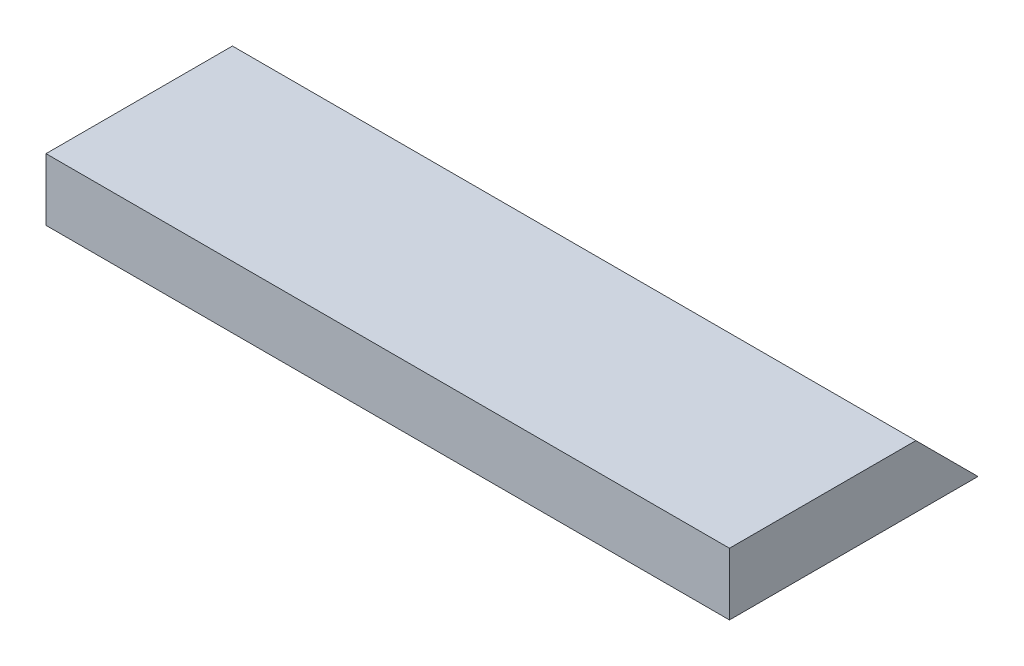
ISO-10303-21;
HEADER;
FILE_DESCRIPTION(('STEP AP214'),'2;1');
FILE_NAME('part.step','',(''),(''),'','','');
FILE_SCHEMA(('AUTOMOTIVE_DESIGN { 1 0 10303 214 1 1 1 1 }'));
ENDSEC;
DATA;
#1=APPLICATION_CONTEXT('core data for automotive mechanical design processes');
#2=APPLICATION_PROTOCOL_DEFINITION('international standard','automotive_design',2000,#1);
#3=PRODUCT_CONTEXT('',#1,'mechanical');
#4=PRODUCT('Part','Part','',(#3));
#5=PRODUCT_RELATED_PRODUCT_CATEGORY('part','',(#4));
#6=PRODUCT_DEFINITION_FORMATION('','',#4);
#7=PRODUCT_DEFINITION_CONTEXT('part definition',#1,'design');
#8=PRODUCT_DEFINITION('design','',#6,#7);
#9=PRODUCT_DEFINITION_SHAPE('','',#8);
#10=(LENGTH_UNIT() NAMED_UNIT(*) SI_UNIT(.MILLI.,.METRE.));
#11=(NAMED_UNIT(*) PLANE_ANGLE_UNIT() SI_UNIT($,.RADIAN.));
#12=(NAMED_UNIT(*) SI_UNIT($,.STERADIAN.) SOLID_ANGLE_UNIT());
#13=UNCERTAINTY_MEASURE_WITH_UNIT(LENGTH_MEASURE(1.E-05),#10,'distance_accuracy_value','');
#14=(GEOMETRIC_REPRESENTATION_CONTEXT(3) GLOBAL_UNCERTAINTY_ASSIGNED_CONTEXT((#13)) GLOBAL_UNIT_ASSIGNED_CONTEXT((#10,
#11,#12)) REPRESENTATION_CONTEXT('',''));
#15=CARTESIAN_POINT('',(0.,0.,0.));
#16=DIRECTION('',(0.,0.,1.));
#17=DIRECTION('',(1.,0.,0.));
#18=AXIS2_PLACEMENT_3D('',#15,#16,#17);
#19=CARTESIAN_POINT('',(0.,5.,0.));
#20=DIRECTION('',(-1.,0.,0.));
#21=DIRECTION('',(0.,0.,1.));
#22=AXIS2_PLACEMENT_3D('',#19,#20,#21);
#23=PLANE('',#22);
#24=DIRECTION('',(0.,0.,-1.));
#25=VECTOR('',#24,1.);
#26=CARTESIAN_POINT('',(0.,0.,0.));
#27=LINE('',#26,#25);
#28=CARTESIAN_POINT('',(0.,0.,0.));
#29=VERTEX_POINT('',#28);
#30=CARTESIAN_POINT('',(0.,0.,-20.));
#31=VERTEX_POINT('',#30);
#32=EDGE_CURVE('E77',#29,#31,#27,.T.);
#33=ORIENTED_EDGE('',*,*,#32,.T.);
#34=DIRECTION('',(0.,-0.707106781186549,-0.707106781186546));
#35=VECTOR('',#34,1.);
#36=CARTESIAN_POINT('',(0.,0.,-20.));
#37=LINE('',#36,#35);
#38=CARTESIAN_POINT('',(0.,5.,-15.));
#39=VERTEX_POINT('',#38);
#40=EDGE_CURVE('E82',#39,#31,#37,.T.);
#41=ORIENTED_EDGE('',*,*,#40,.F.);
#42=DIRECTION('',(0.,0.,-1.));
#43=VECTOR('',#42,1.);
#44=CARTESIAN_POINT('',(0.,5.,0.));
#45=LINE('',#44,#43);
#46=CARTESIAN_POINT('',(0.,5.,0.));
#47=VERTEX_POINT('',#46);
#48=EDGE_CURVE('E72',#47,#39,#45,.T.);
#49=ORIENTED_EDGE('',*,*,#48,.F.);
#50=DIRECTION('',(0.,-1.,0.));
#51=VECTOR('',#50,1.);
#52=CARTESIAN_POINT('',(0.,5.,0.));
#53=LINE('',#52,#51);
#54=EDGE_CURVE('E40',#47,#29,#53,.T.);
#55=ORIENTED_EDGE('',*,*,#54,.T.);
#56=EDGE_LOOP('',(#33,#41,#49,#55));
#57=FACE_BOUND('',#56,.T.);
#58=ADVANCED_FACE('F32',(#57),#23,.F.);
#59=CARTESIAN_POINT('',(-55.,5.,0.));
#60=DIRECTION('',(1.,0.,0.));
#61=DIRECTION('',(0.,0.,-1.));
#62=AXIS2_PLACEMENT_3D('',#59,#60,#61);
#63=PLANE('',#62);
#64=DIRECTION('',(0.,0.,1.));
#65=VECTOR('',#64,1.);
#66=CARTESIAN_POINT('',(-55.,5.,0.));
#67=LINE('',#66,#65);
#68=CARTESIAN_POINT('',(-55.,5.,-15.));
#69=VERTEX_POINT('',#68);
#70=CARTESIAN_POINT('',(-55.,5.,0.));
#71=VERTEX_POINT('',#70);
#72=EDGE_CURVE('E90',#69,#71,#67,.T.);
#73=ORIENTED_EDGE('',*,*,#72,.F.);
#74=DIRECTION('',(0.,0.707106781186549,0.707106781186546));
#75=VECTOR('',#74,1.);
#76=CARTESIAN_POINT('',(-55.,0.,-20.));
#77=LINE('',#76,#75);
#78=CARTESIAN_POINT('',(-55.,0.,-20.));
#79=VERTEX_POINT('',#78);
#80=EDGE_CURVE('E95',#79,#69,#77,.T.);
#81=ORIENTED_EDGE('',*,*,#80,.F.);
#82=DIRECTION('',(0.,0.,1.));
#83=VECTOR('',#82,1.);
#84=CARTESIAN_POINT('',(-55.,0.,0.));
#85=LINE('',#84,#83);
#86=CARTESIAN_POINT('',(-55.,0.,0.));
#87=VERTEX_POINT('',#86);
#88=EDGE_CURVE('E62',#79,#87,#85,.T.);
#89=ORIENTED_EDGE('',*,*,#88,.T.);
#90=DIRECTION('',(0.,-1.,0.));
#91=VECTOR('',#90,1.);
#92=CARTESIAN_POINT('',(-55.,5.,0.));
#93=LINE('',#92,#91);
#94=EDGE_CURVE('E11',#71,#87,#93,.T.);
#95=ORIENTED_EDGE('',*,*,#94,.F.);
#96=EDGE_LOOP('',(#73,#81,#89,#95));
#97=FACE_BOUND('',#96,.T.);
#98=ADVANCED_FACE('F105',(#97),#63,.F.);
#99=CARTESIAN_POINT('',(0.,5.,0.));
#100=DIRECTION('',(0.,0.,-1.));
#101=DIRECTION('',(-1.,0.,0.));
#102=AXIS2_PLACEMENT_3D('',#99,#100,#101);
#103=PLANE('',#102);
#104=DIRECTION('',(1.,0.,0.));
#105=VECTOR('',#104,1.);
#106=CARTESIAN_POINT('',(0.,0.,0.));
#107=LINE('',#106,#105);
#108=EDGE_CURVE('E66',#87,#29,#107,.T.);
#109=ORIENTED_EDGE('',*,*,#108,.T.);
#110=ORIENTED_EDGE('',*,*,#54,.F.);
#111=DIRECTION('',(1.,0.,0.));
#112=VECTOR('',#111,1.);
#113=CARTESIAN_POINT('',(0.,5.,0.));
#114=LINE('',#113,#112);
#115=EDGE_CURVE('E48',#71,#47,#114,.T.);
#116=ORIENTED_EDGE('',*,*,#115,.F.);
#117=ORIENTED_EDGE('',*,*,#94,.T.);
#118=EDGE_LOOP('',(#109,#110,#116,#117));
#119=FACE_BOUND('',#118,.T.);
#120=ADVANCED_FACE('F68',(#119),#103,.F.);
#121=CARTESIAN_POINT('',(0.,5.,0.));
#122=DIRECTION('',(0.,1.,0.));
#123=DIRECTION('',(0.,0.,1.));
#124=AXIS2_PLACEMENT_3D('',#121,#122,#123);
#125=PLANE('',#124);
#126=DIRECTION('',(-1.,0.,0.));
#127=VECTOR('',#126,1.);
#128=CARTESIAN_POINT('',(0.001000000000001,5.,-15.));
#129=LINE('',#128,#127);
#130=EDGE_CURVE('E85',#39,#69,#129,.T.);
#131=ORIENTED_EDGE('',*,*,#130,.T.);
#132=ORIENTED_EDGE('',*,*,#72,.T.);
#133=ORIENTED_EDGE('',*,*,#115,.T.);
#134=ORIENTED_EDGE('',*,*,#48,.T.);
#135=EDGE_LOOP('',(#131,#132,#133,#134));
#136=FACE_BOUND('',#135,.T.);
#137=ADVANCED_FACE('F104',(#136),#125,.T.);
#138=CARTESIAN_POINT('',(0.,0.,0.));
#139=DIRECTION('',(0.,1.,0.));
#140=DIRECTION('',(0.,0.,1.));
#141=AXIS2_PLACEMENT_3D('',#138,#139,#140);
#142=PLANE('',#141);
#143=ORIENTED_EDGE('',*,*,#32,.F.);
#144=ORIENTED_EDGE('',*,*,#108,.F.);
#145=ORIENTED_EDGE('',*,*,#88,.F.);
#146=DIRECTION('',(-1.,0.,0.));
#147=VECTOR('',#146,1.);
#148=CARTESIAN_POINT('',(0.,0.,-20.));
#149=LINE('',#148,#147);
#150=EDGE_CURVE('E81',#31,#79,#149,.T.);
#151=ORIENTED_EDGE('',*,*,#150,.F.);
#152=EDGE_LOOP('',(#143,#144,#145,#151));
#153=FACE_BOUND('',#152,.T.);
#154=ADVANCED_FACE('F79',(#153),#142,.F.);
#155=CARTESIAN_POINT('',(0.001000000000001,0.,-20.));
#156=DIRECTION('',(0.,-0.707106781186546,0.707106781186549));
#157=DIRECTION('',(0.,-0.707106781186549,-0.707106781186546));
#158=AXIS2_PLACEMENT_3D('',#155,#156,#157);
#159=PLANE('',#158);
#160=ORIENTED_EDGE('',*,*,#40,.T.);
#161=ORIENTED_EDGE('',*,*,#150,.T.);
#162=ORIENTED_EDGE('',*,*,#80,.T.);
#163=ORIENTED_EDGE('',*,*,#130,.F.);
#164=EDGE_LOOP('',(#160,#161,#162,#163));
#165=FACE_BOUND('',#164,.T.);
#166=ADVANCED_FACE('F100',(#165),#159,.F.);
#167=CLOSED_SHELL('',(#58,#98,#120,#137,#154,#166));
#168=MANIFOLD_SOLID_BREP('B2',#167);
#169=ADVANCED_BREP_SHAPE_REPRESENTATION('',(#18,#168),#14);
#170=SHAPE_DEFINITION_REPRESENTATION(#9,#169);
ENDSEC;
END-ISO-10303-21;
